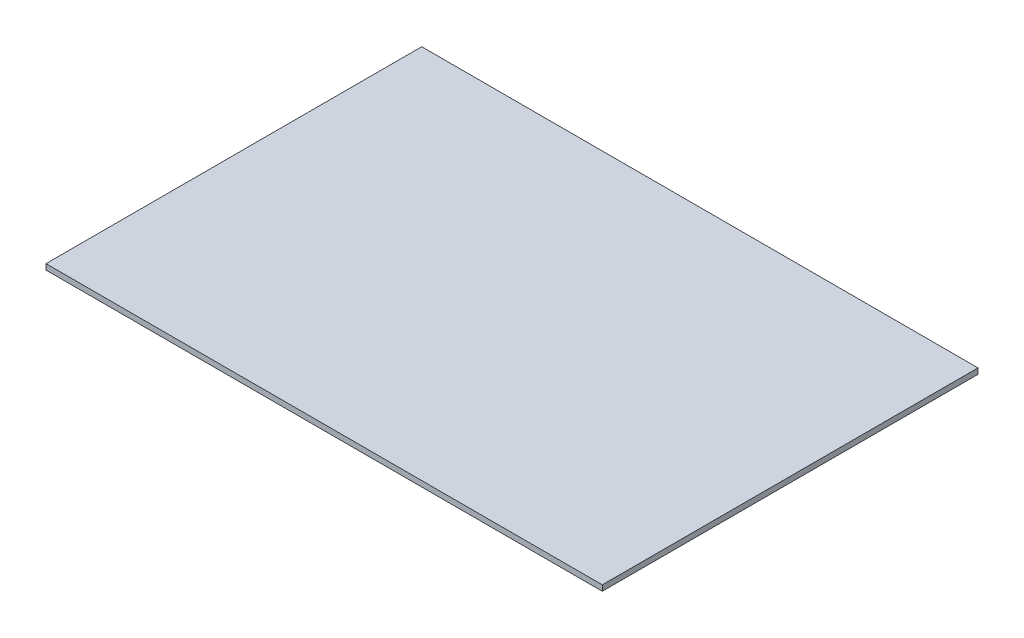
ISO-10303-21;
HEADER;
FILE_DESCRIPTION(('STEP AP214'),'2;1');
FILE_NAME('part.step','',(''),(''),'','','');
FILE_SCHEMA(('AUTOMOTIVE_DESIGN { 1 0 10303 214 1 1 1 1 }'));
ENDSEC;
DATA;
#1=APPLICATION_CONTEXT('core data for automotive mechanical design processes');
#2=APPLICATION_PROTOCOL_DEFINITION('international standard','automotive_design',2000,#1);
#3=PRODUCT_CONTEXT('',#1,'mechanical');
#4=PRODUCT('Part','Part','',(#3));
#5=PRODUCT_RELATED_PRODUCT_CATEGORY('part','',(#4));
#6=PRODUCT_DEFINITION_FORMATION('','',#4);
#7=PRODUCT_DEFINITION_CONTEXT('part definition',#1,'design');
#8=PRODUCT_DEFINITION('design','',#6,#7);
#9=PRODUCT_DEFINITION_SHAPE('','',#8);
#10=(LENGTH_UNIT() NAMED_UNIT(*) SI_UNIT(.MILLI.,.METRE.));
#11=(NAMED_UNIT(*) PLANE_ANGLE_UNIT() SI_UNIT($,.RADIAN.));
#12=(NAMED_UNIT(*) SI_UNIT($,.STERADIAN.) SOLID_ANGLE_UNIT());
#13=UNCERTAINTY_MEASURE_WITH_UNIT(LENGTH_MEASURE(1.E-05),#10,'distance_accuracy_value','');
#14=(GEOMETRIC_REPRESENTATION_CONTEXT(3) GLOBAL_UNCERTAINTY_ASSIGNED_CONTEXT((#13)) GLOBAL_UNIT_ASSIGNED_CONTEXT((#10,
#11,#12)) REPRESENTATION_CONTEXT('',''));
#15=CARTESIAN_POINT('',(0.,0.,0.));
#16=DIRECTION('',(0.,0.,1.));
#17=DIRECTION('',(1.,0.,0.));
#18=AXIS2_PLACEMENT_3D('',#15,#16,#17);
#19=CARTESIAN_POINT('',(-133.859963443564,-4.52441882508929,277.218588355878));
#20=DIRECTION('',(1.,0.,0.));
#21=DIRECTION('',(0.,0.,-1.));
#22=AXIS2_PLACEMENT_3D('',#19,#20,#21);
#23=PLANE('',#22);
#24=DIRECTION('',(0.,0.,-1.));
#25=VECTOR('',#24,1.);
#26=CARTESIAN_POINT('',(-133.859963443564,0.475581174910707,277.218588355878));
#27=LINE('',#26,#25);
#28=CARTESIAN_POINT('',(-133.859963443564,0.475581174910707,277.218588355878));
#29=VERTEX_POINT('',#28);
#30=CARTESIAN_POINT('',(-133.859963443564,0.475581174910707,-57.8322498940454));
#31=VERTEX_POINT('',#30);
#32=EDGE_CURVE('E98',#29,#31,#27,.T.);
#33=ORIENTED_EDGE('',*,*,#32,.T.);
#34=DIRECTION('',(0.,1.,0.));
#35=VECTOR('',#34,1.);
#36=CARTESIAN_POINT('',(-133.859963443564,-4.52441882508929,-57.8322498940454));
#37=LINE('',#36,#35);
#38=CARTESIAN_POINT('',(-133.859963443564,-4.52441882508929,-57.8322498940454));
#39=VERTEX_POINT('',#38);
#40=EDGE_CURVE('E11',#39,#31,#37,.T.);
#41=ORIENTED_EDGE('',*,*,#40,.F.);
#42=DIRECTION('',(0.,0.,-1.));
#43=VECTOR('',#42,1.);
#44=CARTESIAN_POINT('',(-133.859963443564,-4.52441882508929,277.218588355878));
#45=LINE('',#44,#43);
#46=CARTESIAN_POINT('',(-133.859963443564,-4.52441882508929,277.218588355878));
#47=VERTEX_POINT('',#46);
#48=EDGE_CURVE('E86',#47,#39,#45,.T.);
#49=ORIENTED_EDGE('',*,*,#48,.F.);
#50=DIRECTION('',(0.,1.,0.));
#51=VECTOR('',#50,1.);
#52=CARTESIAN_POINT('',(-133.859963443564,-4.52441882508929,277.218588355878));
#53=LINE('',#52,#51);
#54=EDGE_CURVE('E94',#47,#29,#53,.T.);
#55=ORIENTED_EDGE('',*,*,#54,.T.);
#56=EDGE_LOOP('',(#33,#41,#49,#55));
#57=FACE_BOUND('',#56,.T.);
#58=ADVANCED_FACE('F35',(#57),#23,.F.);
#59=CARTESIAN_POINT('',(-133.859963443564,-4.52441882508929,-57.8322498940454));
#60=DIRECTION('',(0.,0.,1.));
#61=DIRECTION('',(1.,0.,0.));
#62=AXIS2_PLACEMENT_3D('',#59,#60,#61);
#63=PLANE('',#62);
#64=DIRECTION('',(1.,0.,0.));
#65=VECTOR('',#64,1.);
#66=CARTESIAN_POINT('',(-133.859963443564,0.475581174910707,-57.8322498940454));
#67=LINE('',#66,#65);
#68=CARTESIAN_POINT('',(362.230483209857,0.475581174910707,-57.8322498940454));
#69=VERTEX_POINT('',#68);
#70=EDGE_CURVE('E90',#31,#69,#67,.T.);
#71=ORIENTED_EDGE('',*,*,#70,.T.);
#72=DIRECTION('',(0.,1.,0.));
#73=VECTOR('',#72,1.);
#74=CARTESIAN_POINT('',(362.230483209857,-4.52441882508929,-57.8322498940454));
#75=LINE('',#74,#73);
#76=CARTESIAN_POINT('',(362.230483209857,-4.52441882508929,-57.8322498940454));
#77=VERTEX_POINT('',#76);
#78=EDGE_CURVE('E43',#77,#69,#75,.T.);
#79=ORIENTED_EDGE('',*,*,#78,.F.);
#80=DIRECTION('',(1.,0.,0.));
#81=VECTOR('',#80,1.);
#82=CARTESIAN_POINT('',(-133.859963443564,-4.52441882508929,-57.8322498940454));
#83=LINE('',#82,#81);
#84=EDGE_CURVE('E81',#39,#77,#83,.T.);
#85=ORIENTED_EDGE('',*,*,#84,.F.);
#86=ORIENTED_EDGE('',*,*,#40,.T.);
#87=EDGE_LOOP('',(#71,#79,#85,#86));
#88=FACE_BOUND('',#87,.T.);
#89=ADVANCED_FACE('F89',(#88),#63,.F.);
#90=CARTESIAN_POINT('',(362.230483209857,-4.52441882508929,277.218588355878));
#91=DIRECTION('',(-1.,0.,0.));
#92=DIRECTION('',(0.,0.,1.));
#93=AXIS2_PLACEMENT_3D('',#90,#91,#92);
#94=PLANE('',#93);
#95=DIRECTION('',(0.,0.,1.));
#96=VECTOR('',#95,1.);
#97=CARTESIAN_POINT('',(362.230483209857,0.475581174910707,277.218588355878));
#98=LINE('',#97,#96);
#99=CARTESIAN_POINT('',(362.230483209857,0.475581174910707,277.218588355878));
#100=VERTEX_POINT('',#99);
#101=EDGE_CURVE('E68',#69,#100,#98,.T.);
#102=ORIENTED_EDGE('',*,*,#101,.T.);
#103=DIRECTION('',(0.,1.,0.));
#104=VECTOR('',#103,1.);
#105=CARTESIAN_POINT('',(362.230483209857,-4.52441882508929,277.218588355878));
#106=LINE('',#105,#104);
#107=CARTESIAN_POINT('',(362.230483209857,-4.52441882508929,277.218588355878));
#108=VERTEX_POINT('',#107);
#109=EDGE_CURVE('E91',#108,#100,#106,.T.);
#110=ORIENTED_EDGE('',*,*,#109,.F.);
#111=DIRECTION('',(0.,0.,1.));
#112=VECTOR('',#111,1.);
#113=CARTESIAN_POINT('',(362.230483209857,-4.52441882508929,277.218588355878));
#114=LINE('',#113,#112);
#115=EDGE_CURVE('E84',#77,#108,#114,.T.);
#116=ORIENTED_EDGE('',*,*,#115,.F.);
#117=ORIENTED_EDGE('',*,*,#78,.T.);
#118=EDGE_LOOP('',(#102,#110,#116,#117));
#119=FACE_BOUND('',#118,.T.);
#120=ADVANCED_FACE('F92',(#119),#94,.F.);
#121=CARTESIAN_POINT('',(-133.859963443564,-4.52441882508929,277.218588355878));
#122=DIRECTION('',(0.,0.,-1.));
#123=DIRECTION('',(-1.,0.,0.));
#124=AXIS2_PLACEMENT_3D('',#121,#122,#123);
#125=PLANE('',#124);
#126=DIRECTION('',(-1.,0.,0.));
#127=VECTOR('',#126,1.);
#128=CARTESIAN_POINT('',(-133.859963443564,0.475581174910707,277.218588355878));
#129=LINE('',#128,#127);
#130=EDGE_CURVE('E74',#100,#29,#129,.T.);
#131=ORIENTED_EDGE('',*,*,#130,.T.);
#132=ORIENTED_EDGE('',*,*,#54,.F.);
#133=DIRECTION('',(-1.,0.,0.));
#134=VECTOR('',#133,1.);
#135=CARTESIAN_POINT('',(-133.859963443564,-4.52441882508929,277.218588355878));
#136=LINE('',#135,#134);
#137=EDGE_CURVE('E51',#108,#47,#136,.T.);
#138=ORIENTED_EDGE('',*,*,#137,.F.);
#139=ORIENTED_EDGE('',*,*,#109,.T.);
#140=EDGE_LOOP('',(#131,#132,#138,#139));
#141=FACE_BOUND('',#140,.T.);
#142=ADVANCED_FACE('F105',(#141),#125,.F.);
#143=CARTESIAN_POINT('',(0.,-4.52441882508929,0.));
#144=DIRECTION('',(0.,-1.,0.));
#145=DIRECTION('',(0.,0.,-1.));
#146=AXIS2_PLACEMENT_3D('',#143,#144,#145);
#147=PLANE('',#146);
#148=ORIENTED_EDGE('',*,*,#48,.T.);
#149=ORIENTED_EDGE('',*,*,#84,.T.);
#150=ORIENTED_EDGE('',*,*,#115,.T.);
#151=ORIENTED_EDGE('',*,*,#137,.T.);
#152=EDGE_LOOP('',(#148,#149,#150,#151));
#153=FACE_BOUND('',#152,.T.);
#154=ADVANCED_FACE('F82',(#153),#147,.T.);
#155=CARTESIAN_POINT('',(0.,0.475581174910707,0.));
#156=DIRECTION('',(0.,-1.,0.));
#157=DIRECTION('',(0.,0.,-1.));
#158=AXIS2_PLACEMENT_3D('',#155,#156,#157);
#159=PLANE('',#158);
#160=ORIENTED_EDGE('',*,*,#32,.F.);
#161=ORIENTED_EDGE('',*,*,#130,.F.);
#162=ORIENTED_EDGE('',*,*,#101,.F.);
#163=ORIENTED_EDGE('',*,*,#70,.F.);
#164=EDGE_LOOP('',(#160,#161,#162,#163));
#165=FACE_BOUND('',#164,.T.);
#166=ADVANCED_FACE('F108',(#165),#159,.F.);
#167=CLOSED_SHELL('',(#58,#89,#120,#142,#154,#166));
#168=MANIFOLD_SOLID_BREP('B2',#167);
#169=ADVANCED_BREP_SHAPE_REPRESENTATION('',(#18,#168),#14);
#170=SHAPE_DEFINITION_REPRESENTATION(#9,#169);
ENDSEC;
END-ISO-10303-21;
